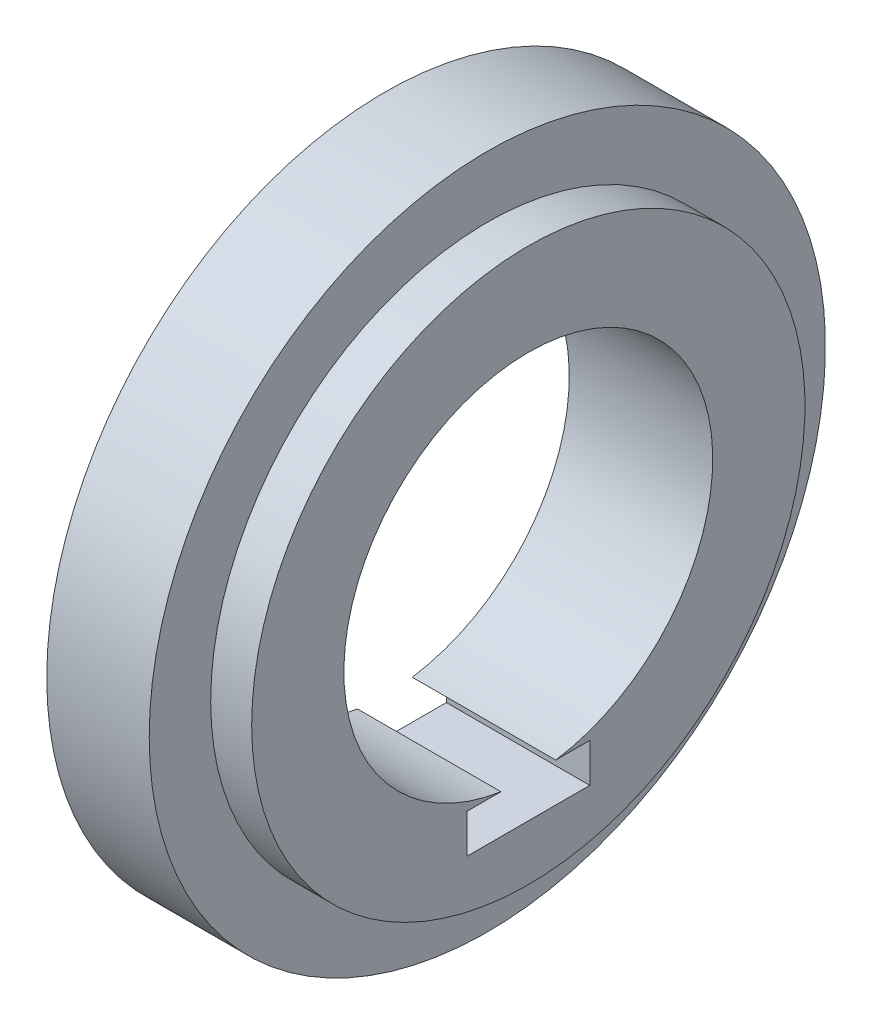
ISO-10303-21;
HEADER;
FILE_DESCRIPTION(('STEP AP214'),'2;1');
FILE_NAME('part.step','',(''),(''),'','','');
FILE_SCHEMA(('AUTOMOTIVE_DESIGN { 1 0 10303 214 1 1 1 1 }'));
ENDSEC;
DATA;
#1=APPLICATION_CONTEXT('core data for automotive mechanical design processes');
#2=APPLICATION_PROTOCOL_DEFINITION('international standard','automotive_design',2000,#1);
#3=PRODUCT_CONTEXT('',#1,'mechanical');
#4=PRODUCT('Part','Part','',(#3));
#5=PRODUCT_RELATED_PRODUCT_CATEGORY('part','',(#4));
#6=PRODUCT_DEFINITION_FORMATION('','',#4);
#7=PRODUCT_DEFINITION_CONTEXT('part definition',#1,'design');
#8=PRODUCT_DEFINITION('design','',#6,#7);
#9=PRODUCT_DEFINITION_SHAPE('','',#8);
#10=(LENGTH_UNIT() NAMED_UNIT(*) SI_UNIT(.MILLI.,.METRE.));
#11=(NAMED_UNIT(*) PLANE_ANGLE_UNIT() SI_UNIT($,.RADIAN.));
#12=(NAMED_UNIT(*) SI_UNIT($,.STERADIAN.) SOLID_ANGLE_UNIT());
#13=UNCERTAINTY_MEASURE_WITH_UNIT(LENGTH_MEASURE(1.E-05),#10,'distance_accuracy_value','');
#14=(GEOMETRIC_REPRESENTATION_CONTEXT(3) GLOBAL_UNCERTAINTY_ASSIGNED_CONTEXT((#13)) GLOBAL_UNIT_ASSIGNED_CONTEXT((#10,
#11,#12)) REPRESENTATION_CONTEXT('',''));
#15=CARTESIAN_POINT('',(0.,0.,0.));
#16=DIRECTION('',(0.,0.,1.));
#17=DIRECTION('',(1.,0.,0.));
#18=AXIS2_PLACEMENT_3D('',#15,#16,#17);
#19=CARTESIAN_POINT('',(-3.,0.,0.));
#20=DIRECTION('',(-1.,0.,0.));
#21=DIRECTION('',(0.,0.,1.));
#22=AXIS2_PLACEMENT_3D('',#19,#20,#21);
#23=CYLINDRICAL_SURFACE('',#22,9.);
#24=DIRECTION('',(-1.,0.,0.));
#25=VECTOR('',#24,1.);
#26=CARTESIAN_POINT('',(-3.,-8.9,1.33790881602596));
#27=LINE('',#26,#25);
#28=CARTESIAN_POINT('',(0.,-8.9,1.33790881602596));
#29=VERTEX_POINT('',#28);
#30=CARTESIAN_POINT('',(7.00000000000001,-8.9,1.33790881602596));
#31=VERTEX_POINT('',#30);
#32=EDGE_CURVE('E54',#29,#31,#27,.F.);
#33=ORIENTED_EDGE('',*,*,#32,.F.);
#34=CARTESIAN_POINT('',(0.,0.,0.));
#35=DIRECTION('',(-1.,0.,0.));
#36=DIRECTION('',(0.,0.,1.));
#37=AXIS2_PLACEMENT_3D('',#34,#35,#36);
#38=CIRCLE('',#37,9.);
#39=CARTESIAN_POINT('',(0.,-8.9,-1.33790881602596));
#40=VERTEX_POINT('',#39);
#41=EDGE_CURVE('E48',#29,#40,#38,.T.);
#42=ORIENTED_EDGE('',*,*,#41,.T.);
#43=DIRECTION('',(-1.,0.,0.));
#44=VECTOR('',#43,1.);
#45=CARTESIAN_POINT('',(-3.,-8.9,-1.33790881602596));
#46=LINE('',#45,#44);
#47=CARTESIAN_POINT('',(7.00000000000001,-8.9,-1.33790881602596));
#48=VERTEX_POINT('',#47);
#49=EDGE_CURVE('E113',#48,#40,#46,.T.);
#50=ORIENTED_EDGE('',*,*,#49,.F.);
#51=CARTESIAN_POINT('',(7.00000000000001,0.,0.));
#52=DIRECTION('',(-1.,0.,0.));
#53=DIRECTION('',(0.,0.,1.));
#54=AXIS2_PLACEMENT_3D('',#51,#52,#53);
#55=CIRCLE('',#54,9.);
#56=EDGE_CURVE('E151',#31,#48,#55,.T.);
#57=ORIENTED_EDGE('',*,*,#56,.F.);
#58=EDGE_LOOP('',(#33,#42,#50,#57));
#59=FACE_BOUND('',#58,.T.);
#60=ADVANCED_FACE('F40',(#59),#23,.F.);
#61=CARTESIAN_POINT('',(0.,9.,0.));
#62=DIRECTION('',(1.,0.,0.));
#63=DIRECTION('',(0.,0.,-1.));
#64=AXIS2_PLACEMENT_3D('',#61,#62,#63);
#65=PLANE('',#64);
#66=CARTESIAN_POINT('',(0.,0.,0.));
#67=DIRECTION('',(-1.,0.,0.));
#68=DIRECTION('',(0.,0.,1.));
#69=AXIS2_PLACEMENT_3D('',#66,#67,#68);
#70=CIRCLE('',#69,16.5);
#71=CARTESIAN_POINT('',(0.,0.,16.5));
#72=VERTEX_POINT('',#71);
#73=EDGE_CURVE('E167',#72,#72,#70,.T.);
#74=ORIENTED_EDGE('',*,*,#73,.T.);
#75=EDGE_LOOP('',(#74));
#76=FACE_BOUND('',#75,.T.);
#77=DIRECTION('',(0.,0.,1.));
#78=VECTOR('',#77,1.);
#79=CARTESIAN_POINT('',(0.,-8.9,3.));
#80=LINE('',#79,#78);
#81=CARTESIAN_POINT('',(0.,-8.9,3.));
#82=VERTEX_POINT('',#81);
#83=EDGE_CURVE('E136',#29,#82,#80,.T.);
#84=ORIENTED_EDGE('',*,*,#83,.T.);
#85=DIRECTION('',(0.,-1.,0.));
#86=VECTOR('',#85,1.);
#87=CARTESIAN_POINT('',(0.,-10.8,3.));
#88=LINE('',#87,#86);
#89=CARTESIAN_POINT('',(0.,-10.8,3.));
#90=VERTEX_POINT('',#89);
#91=EDGE_CURVE('E127',#82,#90,#88,.T.);
#92=ORIENTED_EDGE('',*,*,#91,.T.);
#93=DIRECTION('',(0.,0.,-1.));
#94=VECTOR('',#93,1.);
#95=CARTESIAN_POINT('',(0.,-10.8,3.));
#96=LINE('',#95,#94);
#97=CARTESIAN_POINT('',(0.,-10.8,-3.));
#98=VERTEX_POINT('',#97);
#99=EDGE_CURVE('E111',#90,#98,#96,.T.);
#100=ORIENTED_EDGE('',*,*,#99,.T.);
#101=DIRECTION('',(0.,1.,0.));
#102=VECTOR('',#101,1.);
#103=CARTESIAN_POINT('',(0.,-10.8,-3.));
#104=LINE('',#103,#102);
#105=CARTESIAN_POINT('',(0.,-8.9,-3.));
#106=VERTEX_POINT('',#105);
#107=EDGE_CURVE('E132',#98,#106,#104,.T.);
#108=ORIENTED_EDGE('',*,*,#107,.T.);
#109=EDGE_CURVE('E105',#106,#40,#80,.T.);
#110=ORIENTED_EDGE('',*,*,#109,.T.);
#111=ORIENTED_EDGE('',*,*,#41,.F.);
#112=EDGE_LOOP('',(#84,#92,#100,#108,#110,#111));
#113=FACE_BOUND('',#112,.T.);
#114=ADVANCED_FACE('F178',(#76,#113),#65,.F.);
#115=CARTESIAN_POINT('',(7.00000000000001,13.5,0.));
#116=DIRECTION('',(-1.,0.,0.));
#117=DIRECTION('',(0.,0.,1.));
#118=AXIS2_PLACEMENT_3D('',#115,#116,#117);
#119=PLANE('',#118);
#120=CARTESIAN_POINT('',(7.00000000000001,0.,0.));
#121=DIRECTION('',(-1.,0.,0.));
#122=DIRECTION('',(0.,0.,1.));
#123=AXIS2_PLACEMENT_3D('',#120,#121,#122);
#124=CIRCLE('',#123,13.5);
#125=CARTESIAN_POINT('',(7.00000000000001,0.,13.5));
#126=VERTEX_POINT('',#125);
#127=EDGE_CURVE('E155',#126,#126,#124,.T.);
#128=ORIENTED_EDGE('',*,*,#127,.F.);
#129=EDGE_LOOP('',(#128));
#130=FACE_BOUND('',#129,.T.);
#131=DIRECTION('',(0.,0.,1.));
#132=VECTOR('',#131,1.);
#133=CARTESIAN_POINT('',(7.00000000000001,-8.9,3.));
#134=LINE('',#133,#132);
#135=CARTESIAN_POINT('',(7.00000000000001,-8.9,-3.));
#136=VERTEX_POINT('',#135);
#137=EDGE_CURVE('E62',#136,#48,#134,.T.);
#138=ORIENTED_EDGE('',*,*,#137,.F.);
#139=DIRECTION('',(0.,1.,0.));
#140=VECTOR('',#139,1.);
#141=CARTESIAN_POINT('',(7.00000000000001,-10.8,-3.));
#142=LINE('',#141,#140);
#143=CARTESIAN_POINT('',(7.00000000000001,-10.8,-3.));
#144=VERTEX_POINT('',#143);
#145=EDGE_CURVE('E118',#144,#136,#142,.T.);
#146=ORIENTED_EDGE('',*,*,#145,.F.);
#147=DIRECTION('',(0.,0.,-1.));
#148=VECTOR('',#147,1.);
#149=CARTESIAN_POINT('',(7.00000000000001,-10.8,3.));
#150=LINE('',#149,#148);
#151=CARTESIAN_POINT('',(7.00000000000001,-10.8,3.));
#152=VERTEX_POINT('',#151);
#153=EDGE_CURVE('E104',#152,#144,#150,.T.);
#154=ORIENTED_EDGE('',*,*,#153,.F.);
#155=DIRECTION('',(0.,-1.,0.));
#156=VECTOR('',#155,1.);
#157=CARTESIAN_POINT('',(7.00000000000001,-10.8,3.));
#158=LINE('',#157,#156);
#159=CARTESIAN_POINT('',(7.00000000000001,-8.9,3.));
#160=VERTEX_POINT('',#159);
#161=EDGE_CURVE('E94',#160,#152,#158,.T.);
#162=ORIENTED_EDGE('',*,*,#161,.F.);
#163=DIRECTION('',(0.,0.,1.));
#164=VECTOR('',#163,1.);
#165=CARTESIAN_POINT('',(7.00000000000001,-8.9,0.));
#166=LINE('',#165,#164);
#167=EDGE_CURVE('E11',#31,#160,#166,.T.);
#168=ORIENTED_EDGE('',*,*,#167,.F.);
#169=ORIENTED_EDGE('',*,*,#56,.T.);
#170=EDGE_LOOP('',(#138,#146,#154,#162,#168,#169));
#171=FACE_BOUND('',#170,.T.);
#172=ADVANCED_FACE('F117',(#130,#171),#119,.F.);
#173=CARTESIAN_POINT('',(-3.,0.,0.));
#174=DIRECTION('',(-1.,0.,0.));
#175=DIRECTION('',(0.,0.,1.));
#176=AXIS2_PLACEMENT_3D('',#173,#174,#175);
#177=CYLINDRICAL_SURFACE('',#176,16.5);
#178=ORIENTED_EDGE('',*,*,#73,.F.);
#179=EDGE_LOOP('',(#178));
#180=FACE_BOUND('',#179,.T.);
#181=CARTESIAN_POINT('',(5.,0.,0.));
#182=DIRECTION('',(-1.,0.,0.));
#183=DIRECTION('',(0.,0.,1.));
#184=AXIS2_PLACEMENT_3D('',#181,#182,#183);
#185=CIRCLE('',#184,16.5);
#186=CARTESIAN_POINT('',(5.,0.,16.5));
#187=VERTEX_POINT('',#186);
#188=EDGE_CURVE('E163',#187,#187,#185,.T.);
#189=ORIENTED_EDGE('',*,*,#188,.T.);
#190=EDGE_LOOP('',(#189));
#191=FACE_BOUND('',#190,.T.);
#192=ADVANCED_FACE('F210',(#180,#191),#177,.T.);
#193=CARTESIAN_POINT('',(5.,16.5,0.));
#194=DIRECTION('',(-1.,0.,0.));
#195=DIRECTION('',(0.,0.,1.));
#196=AXIS2_PLACEMENT_3D('',#193,#194,#195);
#197=PLANE('',#196);
#198=ORIENTED_EDGE('',*,*,#188,.F.);
#199=EDGE_LOOP('',(#198));
#200=FACE_BOUND('',#199,.T.);
#201=CARTESIAN_POINT('',(5.,0.,0.));
#202=DIRECTION('',(-1.,0.,0.));
#203=DIRECTION('',(0.,0.,1.));
#204=AXIS2_PLACEMENT_3D('',#201,#202,#203);
#205=CIRCLE('',#204,13.5);
#206=CARTESIAN_POINT('',(5.,0.,13.5));
#207=VERTEX_POINT('',#206);
#208=EDGE_CURVE('E159',#207,#207,#205,.T.);
#209=ORIENTED_EDGE('',*,*,#208,.T.);
#210=EDGE_LOOP('',(#209));
#211=FACE_BOUND('',#210,.T.);
#212=ADVANCED_FACE('F198',(#200,#211),#197,.F.);
#213=CARTESIAN_POINT('',(-3.,0.,0.));
#214=DIRECTION('',(-1.,0.,0.));
#215=DIRECTION('',(0.,0.,1.));
#216=AXIS2_PLACEMENT_3D('',#213,#214,#215);
#217=CYLINDRICAL_SURFACE('',#216,13.5);
#218=ORIENTED_EDGE('',*,*,#208,.F.);
#219=EDGE_LOOP('',(#218));
#220=FACE_BOUND('',#219,.T.);
#221=ORIENTED_EDGE('',*,*,#127,.T.);
#222=EDGE_LOOP('',(#221));
#223=FACE_BOUND('',#222,.T.);
#224=ADVANCED_FACE('F192',(#220,#223),#217,.T.);
#225=CARTESIAN_POINT('',(7.00000000000001,-8.9,3.));
#226=DIRECTION('',(0.,-1.,0.));
#227=DIRECTION('',(0.,0.,-1.));
#228=AXIS2_PLACEMENT_3D('',#225,#226,#227);
#229=PLANE('',#228);
#230=ORIENTED_EDGE('',*,*,#32,.T.);
#231=ORIENTED_EDGE('',*,*,#167,.T.);
#232=DIRECTION('',(-1.,0.,0.));
#233=VECTOR('',#232,1.);
#234=CARTESIAN_POINT('',(7.00000000000001,-8.9,3.));
#235=LINE('',#234,#233);
#236=EDGE_CURVE('E100',#160,#82,#235,.T.);
#237=ORIENTED_EDGE('',*,*,#236,.T.);
#238=ORIENTED_EDGE('',*,*,#83,.F.);
#239=EDGE_LOOP('',(#230,#231,#237,#238));
#240=FACE_BOUND('',#239,.T.);
#241=ADVANCED_FACE('F183',(#240),#229,.T.);
#242=ORIENTED_EDGE('',*,*,#49,.T.);
#243=ORIENTED_EDGE('',*,*,#109,.F.);
#244=DIRECTION('',(-1.,0.,0.));
#245=VECTOR('',#244,1.);
#246=CARTESIAN_POINT('',(7.00000000000001,-8.9,-3.));
#247=LINE('',#246,#245);
#248=EDGE_CURVE('E142',#136,#106,#247,.T.);
#249=ORIENTED_EDGE('',*,*,#248,.F.);
#250=ORIENTED_EDGE('',*,*,#137,.T.);
#251=EDGE_LOOP('',(#242,#243,#249,#250));
#252=FACE_BOUND('',#251,.T.);
#253=ADVANCED_FACE('F181',(#252),#229,.T.);
#254=CARTESIAN_POINT('',(7.00000000000001,-10.8,3.));
#255=DIRECTION('',(0.,0.,-1.));
#256=DIRECTION('',(-1.,0.,0.));
#257=AXIS2_PLACEMENT_3D('',#254,#255,#256);
#258=PLANE('',#257);
#259=ORIENTED_EDGE('',*,*,#91,.F.);
#260=ORIENTED_EDGE('',*,*,#236,.F.);
#261=ORIENTED_EDGE('',*,*,#161,.T.);
#262=DIRECTION('',(-1.,0.,0.));
#263=VECTOR('',#262,1.);
#264=CARTESIAN_POINT('',(7.00000000000001,-10.8,3.));
#265=LINE('',#264,#263);
#266=EDGE_CURVE('E98',#152,#90,#265,.T.);
#267=ORIENTED_EDGE('',*,*,#266,.T.);
#268=EDGE_LOOP('',(#259,#260,#261,#267));
#269=FACE_BOUND('',#268,.T.);
#270=ADVANCED_FACE('F97',(#269),#258,.T.);
#271=CARTESIAN_POINT('',(7.00000000000001,-10.8,3.));
#272=DIRECTION('',(0.,1.,0.));
#273=DIRECTION('',(0.,0.,1.));
#274=AXIS2_PLACEMENT_3D('',#271,#272,#273);
#275=PLANE('',#274);
#276=ORIENTED_EDGE('',*,*,#99,.F.);
#277=ORIENTED_EDGE('',*,*,#266,.F.);
#278=ORIENTED_EDGE('',*,*,#153,.T.);
#279=DIRECTION('',(-1.,0.,0.));
#280=VECTOR('',#279,1.);
#281=CARTESIAN_POINT('',(7.00000000000001,-10.8,-3.));
#282=LINE('',#281,#280);
#283=EDGE_CURVE('E114',#144,#98,#282,.T.);
#284=ORIENTED_EDGE('',*,*,#283,.T.);
#285=EDGE_LOOP('',(#276,#277,#278,#284));
#286=FACE_BOUND('',#285,.T.);
#287=ADVANCED_FACE('F108',(#286),#275,.T.);
#288=CARTESIAN_POINT('',(7.00000000000001,-10.8,-3.));
#289=DIRECTION('',(0.,0.,1.));
#290=DIRECTION('',(1.,0.,0.));
#291=AXIS2_PLACEMENT_3D('',#288,#289,#290);
#292=PLANE('',#291);
#293=ORIENTED_EDGE('',*,*,#107,.F.);
#294=ORIENTED_EDGE('',*,*,#283,.F.);
#295=ORIENTED_EDGE('',*,*,#145,.T.);
#296=ORIENTED_EDGE('',*,*,#248,.T.);
#297=EDGE_LOOP('',(#293,#294,#295,#296));
#298=FACE_BOUND('',#297,.T.);
#299=ADVANCED_FACE('F223',(#298),#292,.T.);
#300=CLOSED_SHELL('',(#60,#114,#172,#192,#212,#224,#241,#253,#270,#287,#299));
#301=MANIFOLD_SOLID_BREP('B2',#300);
#302=ADVANCED_BREP_SHAPE_REPRESENTATION('',(#18,#301),#14);
#303=SHAPE_DEFINITION_REPRESENTATION(#9,#302);
ENDSEC;
END-ISO-10303-21;
